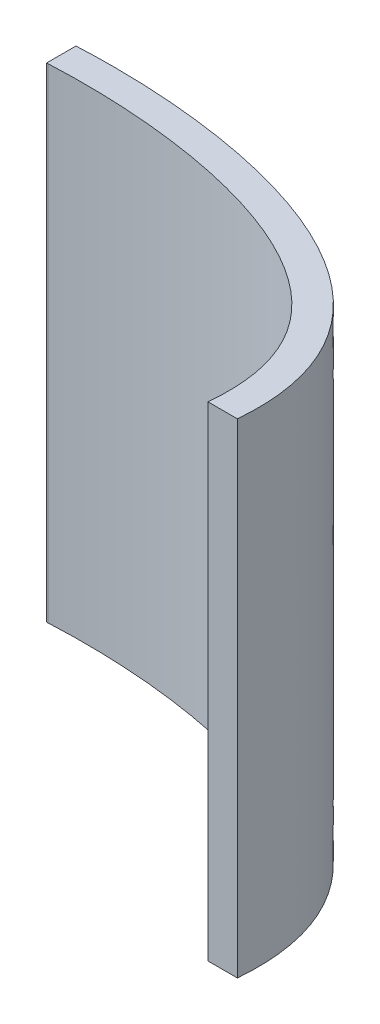
ISO-10303-21;
HEADER;
FILE_DESCRIPTION(('STEP AP214'),'2;1');
FILE_NAME('part.step','',(''),(''),'','','');
FILE_SCHEMA(('AUTOMOTIVE_DESIGN { 1 0 10303 214 1 1 1 1 }'));
ENDSEC;
DATA;
#1=APPLICATION_CONTEXT('core data for automotive mechanical design processes');
#2=APPLICATION_PROTOCOL_DEFINITION('international standard','automotive_design',2000,#1);
#3=PRODUCT_CONTEXT('',#1,'mechanical');
#4=PRODUCT('Part','Part','',(#3));
#5=PRODUCT_RELATED_PRODUCT_CATEGORY('part','',(#4));
#6=PRODUCT_DEFINITION_FORMATION('','',#4);
#7=PRODUCT_DEFINITION_CONTEXT('part definition',#1,'design');
#8=PRODUCT_DEFINITION('design','',#6,#7);
#9=PRODUCT_DEFINITION_SHAPE('','',#8);
#10=(LENGTH_UNIT() NAMED_UNIT(*) SI_UNIT(.MILLI.,.METRE.));
#11=(NAMED_UNIT(*) PLANE_ANGLE_UNIT() SI_UNIT($,.RADIAN.));
#12=(NAMED_UNIT(*) SI_UNIT($,.STERADIAN.) SOLID_ANGLE_UNIT());
#13=UNCERTAINTY_MEASURE_WITH_UNIT(LENGTH_MEASURE(1.E-05),#10,'distance_accuracy_value','');
#14=(GEOMETRIC_REPRESENTATION_CONTEXT(3) GLOBAL_UNCERTAINTY_ASSIGNED_CONTEXT((#13)) GLOBAL_UNIT_ASSIGNED_CONTEXT((#10,
#11,#12)) REPRESENTATION_CONTEXT('',''));
#15=CARTESIAN_POINT('',(0.,0.,0.));
#16=DIRECTION('',(0.,0.,1.));
#17=DIRECTION('',(1.,0.,0.));
#18=AXIS2_PLACEMENT_3D('',#15,#16,#17);
#19=CARTESIAN_POINT('',(183.579673977619,66.,-98.403989325521));
#20=CARTESIAN_POINT('',(186.002119086977,66.,-126.403762249864));
#21=CARTESIAN_POINT('',(150.81789137125,66.,-132.515318450877));
#22=CARTESIAN_POINT('',(128.579673977619,66.,-131.403989325521));
#23=B_SPLINE_CURVE_WITH_KNOTS('',3,(#19,#20,#21,#22),.UNSPECIFIED.,.F.,.F.,(4,4),(0.,1.),.UNSPECIFIED.);
#24=DIRECTION('',(0.,-1.,0.));
#25=VECTOR('',#24,1.);
#26=SURFACE_OF_LINEAR_EXTRUSION('',#23,#25);
#27=CARTESIAN_POINT('',(183.579673977619,0.,-98.403989325521));
#28=CARTESIAN_POINT('',(186.002119086977,0.,-126.403762249864));
#29=CARTESIAN_POINT('',(150.81789137125,0.,-132.515318450877));
#30=CARTESIAN_POINT('',(128.579673977619,0.,-131.403989325521));
#31=B_SPLINE_CURVE_WITH_KNOTS('',3,(#27,#28,#29,#30),.UNSPECIFIED.,.F.,.F.,(4,4),(0.,1.),.UNSPECIFIED.);
#32=CARTESIAN_POINT('',(183.579673977619,0.,-98.403989325521));
#33=VERTEX_POINT('',#32);
#34=CARTESIAN_POINT('',(128.579673977619,0.,-131.403989325521));
#35=VERTEX_POINT('',#34);
#36=EDGE_CURVE('E123',#33,#35,#31,.T.);
#37=ORIENTED_EDGE('',*,*,#36,.T.);
#38=DIRECTION('',(0.,-1.,0.));
#39=VECTOR('',#38,1.);
#40=CARTESIAN_POINT('',(128.579673977619,66.,-131.403989325521));
#41=LINE('',#40,#39);
#42=CARTESIAN_POINT('',(128.579673977619,66.,-131.403989325521));
#43=VERTEX_POINT('',#42);
#44=EDGE_CURVE('E11',#43,#35,#41,.T.);
#45=ORIENTED_EDGE('',*,*,#44,.F.);
#46=CARTESIAN_POINT('',(183.579673977619,66.,-98.403989325521));
#47=VERTEX_POINT('',#46);
#48=EDGE_CURVE('E143',#47,#43,#23,.T.);
#49=ORIENTED_EDGE('',*,*,#48,.F.);
#50=DIRECTION('',(0.,-1.,0.));
#51=VECTOR('',#50,1.);
#52=CARTESIAN_POINT('',(183.579673977619,66.,-98.403989325521));
#53=LINE('',#52,#51);
#54=EDGE_CURVE('E116',#47,#33,#53,.T.);
#55=ORIENTED_EDGE('',*,*,#54,.T.);
#56=EDGE_LOOP('',(#37,#45,#49,#55));
#57=FACE_BOUND('',#56,.T.);
#58=ADVANCED_FACE('F35',(#57),#26,.F.);
#59=CARTESIAN_POINT('',(128.579673977619,66.,-127.403989325521));
#60=DIRECTION('',(1.,0.,0.));
#61=DIRECTION('',(0.,0.,-1.));
#62=AXIS2_PLACEMENT_3D('',#59,#60,#61);
#63=PLANE('',#62);
#64=DIRECTION('',(0.,0.,1.));
#65=VECTOR('',#64,1.);
#66=CARTESIAN_POINT('',(128.579673977619,0.,-127.403989325521));
#67=LINE('',#66,#65);
#68=CARTESIAN_POINT('',(128.579673977619,0.,-127.403989325521));
#69=VERTEX_POINT('',#68);
#70=EDGE_CURVE('E128',#35,#69,#67,.T.);
#71=ORIENTED_EDGE('',*,*,#70,.T.);
#72=DIRECTION('',(0.,-1.,0.));
#73=VECTOR('',#72,1.);
#74=CARTESIAN_POINT('',(128.579673977619,66.,-127.403989325521));
#75=LINE('',#74,#73);
#76=CARTESIAN_POINT('',(128.579673977619,66.,-127.403989325521));
#77=VERTEX_POINT('',#76);
#78=EDGE_CURVE('E44',#77,#69,#75,.T.);
#79=ORIENTED_EDGE('',*,*,#78,.F.);
#80=DIRECTION('',(0.,0.,1.));
#81=VECTOR('',#80,1.);
#82=CARTESIAN_POINT('',(128.579673977619,66.,-127.403989325521));
#83=LINE('',#82,#81);
#84=EDGE_CURVE('E89',#43,#77,#83,.T.);
#85=ORIENTED_EDGE('',*,*,#84,.F.);
#86=ORIENTED_EDGE('',*,*,#44,.T.);
#87=EDGE_LOOP('',(#71,#79,#85,#86));
#88=FACE_BOUND('',#87,.T.);
#89=ADVANCED_FACE('F167',(#88),#63,.F.);
#90=CARTESIAN_POINT('',(128.779320197701,66.,-127.408974758989));
#91=DIRECTION('',(-0.02496355710716,0.,-0.99968836184911));
#92=DIRECTION('',(-0.99968836184911,0.,0.02496355710716));
#93=AXIS2_PLACEMENT_3D('',#90,#91,#92);
#94=PLANE('',#93);
#95=DIRECTION('',(0.99968836184911,0.,-0.02496355710716));
#96=VECTOR('',#95,1.);
#97=CARTESIAN_POINT('',(128.779320197701,0.,-127.408974758989));
#98=LINE('',#97,#96);
#99=CARTESIAN_POINT('',(128.779320197701,0.,-127.408974758989));
#100=VERTEX_POINT('',#99);
#101=EDGE_CURVE('E133',#69,#100,#98,.T.);
#102=ORIENTED_EDGE('',*,*,#101,.T.);
#103=DIRECTION('',(0.,-1.,0.));
#104=VECTOR('',#103,1.);
#105=CARTESIAN_POINT('',(128.779320197701,66.,-127.408974758989));
#106=LINE('',#105,#104);
#107=CARTESIAN_POINT('',(128.779320197701,66.,-127.408974758989));
#108=VERTEX_POINT('',#107);
#109=EDGE_CURVE('E111',#108,#100,#106,.T.);
#110=ORIENTED_EDGE('',*,*,#109,.F.);
#111=DIRECTION('',(0.99968836184911,0.,-0.02496355710716));
#112=VECTOR('',#111,1.);
#113=CARTESIAN_POINT('',(128.779320197701,66.,-127.408974758989));
#114=LINE('',#113,#112);
#115=EDGE_CURVE('E102',#77,#108,#114,.T.);
#116=ORIENTED_EDGE('',*,*,#115,.F.);
#117=ORIENTED_EDGE('',*,*,#78,.T.);
#118=EDGE_LOOP('',(#102,#110,#116,#117));
#119=FACE_BOUND('',#118,.T.);
#120=ADVANCED_FACE('F149',(#119),#94,.F.);
#121=CARTESIAN_POINT('',(128.779320197701,66.,-127.408974758989));
#122=CARTESIAN_POINT('',(129.456925244593,66.,-127.442837285412));
#123=CARTESIAN_POINT('',(130.796469521896,66.,-127.495054960408));
#124=CARTESIAN_POINT('',(133.608856634455,66.,-127.544195587618));
#125=CARTESIAN_POINT('',(137.25196993619,66.,-127.490289040362));
#126=CARTESIAN_POINT('',(141.777282013881,66.,-127.221776910639));
#127=CARTESIAN_POINT('',(147.898035457045,66.,-126.565632751634));
#128=CARTESIAN_POINT('',(155.516447722676,66.,-125.140481347101));
#129=CARTESIAN_POINT('',(163.959933838613,66.,-122.341583271431));
#130=CARTESIAN_POINT('',(169.876032605257,66.,-119.055757917601));
#131=CARTESIAN_POINT('',(173.667431344113,66.,-115.871614333157));
#132=CARTESIAN_POINT('',(176.001562959465,66.,-113.207973183674));
#133=CARTESIAN_POINT('',(177.804863705281,66.,-110.248156926474));
#134=CARTESIAN_POINT('',(178.852838991469,66.,-107.484701631807));
#135=CARTESIAN_POINT('',(179.396589335684,66.,-105.048198520399));
#136=CARTESIAN_POINT('',(179.647182856934,66.,-103.096696056337));
#137=CARTESIAN_POINT('',(179.714900134768,66.,-101.353981418927));
#138=CARTESIAN_POINT('',(179.678303177813,66.,-99.8940338893161));
#139=CARTESIAN_POINT('',(179.6272707756,66.,-99.1268463675959));
#140=CARTESIAN_POINT('',(179.594560701445,66.,-98.7487677704102));
#141=B_SPLINE_CURVE_WITH_KNOTS('',3,(#121,#122,#123,#124,#125,#126,#127,#128,#129,#130,#131,
#132,#133,#134,#135,#136,#137,#138,#139,#140),.UNSPECIFIED.,.F.,.F.,(4,1,1,1,1,1,1,1,1,1,1,1,1,
1,1,1,1,4),(0.,0.03125,0.0625,0.125,0.1875,0.25,0.375,0.5,0.625,0.6875,0.75,0.8125,0.875,
0.90625,0.9375,0.96875,0.984375,1.),.UNSPECIFIED.);
#142=DIRECTION('',(0.,-1.,0.));
#143=VECTOR('',#142,1.);
#144=SURFACE_OF_LINEAR_EXTRUSION('',#141,#143);
#145=CARTESIAN_POINT('',(128.779320197701,0.,-127.408974758989));
#146=CARTESIAN_POINT('',(129.456925244593,0.,-127.442837285412));
#147=CARTESIAN_POINT('',(130.796469521896,0.,-127.495054960408));
#148=CARTESIAN_POINT('',(133.608856634455,0.,-127.544195587618));
#149=CARTESIAN_POINT('',(137.25196993619,0.,-127.490289040362));
#150=CARTESIAN_POINT('',(141.777282013881,0.,-127.221776910639));
#151=CARTESIAN_POINT('',(147.898035457045,0.,-126.565632751634));
#152=CARTESIAN_POINT('',(155.516447722676,0.,-125.140481347101));
#153=CARTESIAN_POINT('',(163.959933838613,0.,-122.341583271431));
#154=CARTESIAN_POINT('',(169.876032605257,0.,-119.055757917601));
#155=CARTESIAN_POINT('',(173.667431344113,0.,-115.871614333157));
#156=CARTESIAN_POINT('',(176.001562959465,0.,-113.207973183674));
#157=CARTESIAN_POINT('',(177.804863705281,0.,-110.248156926474));
#158=CARTESIAN_POINT('',(178.852838991469,0.,-107.484701631807));
#159=CARTESIAN_POINT('',(179.396589335684,0.,-105.048198520399));
#160=CARTESIAN_POINT('',(179.647182856934,0.,-103.096696056337));
#161=CARTESIAN_POINT('',(179.714900134768,0.,-101.353981418927));
#162=CARTESIAN_POINT('',(179.678303177813,0.,-99.8940338893161));
#163=CARTESIAN_POINT('',(179.6272707756,0.,-99.1268463675959));
#164=CARTESIAN_POINT('',(179.594560701445,0.,-98.7487677704102));
#165=B_SPLINE_CURVE_WITH_KNOTS('',3,(#145,#146,#147,#148,#149,#150,#151,#152,#153,#154,#155,
#156,#157,#158,#159,#160,#161,#162,#163,#164),.UNSPECIFIED.,.F.,.F.,(4,1,1,1,1,1,1,1,1,1,1,1,1,
1,1,1,1,4),(0.,0.03125,0.0625,0.125,0.1875,0.25,0.375,0.5,0.625,0.6875,0.75,0.8125,0.875,
0.90625,0.9375,0.96875,0.984375,1.),.UNSPECIFIED.);
#166=CARTESIAN_POINT('',(179.594560701445,0.,-98.7487677704102));
#167=VERTEX_POINT('',#166);
#168=EDGE_CURVE('E110',#100,#167,#165,.T.);
#169=ORIENTED_EDGE('',*,*,#168,.T.);
#170=DIRECTION('',(0.,-1.,0.));
#171=VECTOR('',#170,1.);
#172=CARTESIAN_POINT('',(179.594560701445,66.,-98.7487677704102));
#173=LINE('',#172,#171);
#174=CARTESIAN_POINT('',(179.594560701445,66.,-98.7487677704102));
#175=VERTEX_POINT('',#174);
#176=EDGE_CURVE('E107',#175,#167,#173,.T.);
#177=ORIENTED_EDGE('',*,*,#176,.F.);
#178=EDGE_CURVE('E96',#108,#175,#141,.T.);
#179=ORIENTED_EDGE('',*,*,#178,.F.);
#180=ORIENTED_EDGE('',*,*,#109,.T.);
#181=EDGE_LOOP('',(#169,#177,#179,#180));
#182=FACE_BOUND('',#181,.T.);
#183=ADVANCED_FACE('F108',(#182),#144,.F.);
#184=CARTESIAN_POINT('',(179.594560701445,66.,-98.7487677704102));
#185=DIRECTION('',(0.999069146516781,0.,0.043137460266332));
#186=DIRECTION('',(0.0431374602663321,0.,-0.999069146516782));
#187=AXIS2_PLACEMENT_3D('',#184,#185,#186);
#188=PLANE('',#187);
#189=DIRECTION('',(-0.0431374602663321,0.,0.999069146516782));
#190=VECTOR('',#189,1.);
#191=CARTESIAN_POINT('',(179.594560701445,0.,-98.7487677704102));
#192=LINE('',#191,#190);
#193=CARTESIAN_POINT('',(179.579673977619,0.,-98.403989325521));
#194=VERTEX_POINT('',#193);
#195=EDGE_CURVE('E75',#167,#194,#192,.T.);
#196=ORIENTED_EDGE('',*,*,#195,.T.);
#197=DIRECTION('',(0.,-1.,0.));
#198=VECTOR('',#197,1.);
#199=CARTESIAN_POINT('',(179.579673977619,66.,-98.403989325521));
#200=LINE('',#199,#198);
#201=CARTESIAN_POINT('',(179.579673977619,66.,-98.403989325521));
#202=VERTEX_POINT('',#201);
#203=EDGE_CURVE('E112',#202,#194,#200,.T.);
#204=ORIENTED_EDGE('',*,*,#203,.F.);
#205=DIRECTION('',(-0.0431374602663321,0.,0.999069146516782));
#206=VECTOR('',#205,1.);
#207=CARTESIAN_POINT('',(179.594560701445,66.,-98.7487677704102));
#208=LINE('',#207,#206);
#209=EDGE_CURVE('E100',#175,#202,#208,.T.);
#210=ORIENTED_EDGE('',*,*,#209,.F.);
#211=ORIENTED_EDGE('',*,*,#176,.T.);
#212=EDGE_LOOP('',(#196,#204,#210,#211));
#213=FACE_BOUND('',#212,.T.);
#214=ADVANCED_FACE('F114',(#213),#188,.F.);
#215=CARTESIAN_POINT('',(179.579673977619,66.,-98.403989325521));
#216=DIRECTION('',(0.,0.,-1.));
#217=DIRECTION('',(-1.,0.,0.));
#218=AXIS2_PLACEMENT_3D('',#215,#216,#217);
#219=PLANE('',#218);
#220=DIRECTION('',(1.,0.,0.));
#221=VECTOR('',#220,1.);
#222=CARTESIAN_POINT('',(179.579673977619,0.,-98.403989325521));
#223=LINE('',#222,#221);
#224=EDGE_CURVE('E81',#194,#33,#223,.T.);
#225=ORIENTED_EDGE('',*,*,#224,.T.);
#226=ORIENTED_EDGE('',*,*,#54,.F.);
#227=DIRECTION('',(1.,0.,0.));
#228=VECTOR('',#227,1.);
#229=CARTESIAN_POINT('',(179.579673977619,66.,-98.403989325521));
#230=LINE('',#229,#228);
#231=EDGE_CURVE('E52',#202,#47,#230,.T.);
#232=ORIENTED_EDGE('',*,*,#231,.F.);
#233=ORIENTED_EDGE('',*,*,#203,.T.);
#234=EDGE_LOOP('',(#225,#226,#232,#233));
#235=FACE_BOUND('',#234,.T.);
#236=ADVANCED_FACE('F156',(#235),#219,.F.);
#237=CARTESIAN_POINT('',(165.32742241624,66.,-125.820652594158));
#238=DIRECTION('',(0.,1.,0.));
#239=DIRECTION('',(0.,0.,1.));
#240=AXIS2_PLACEMENT_3D('',#237,#238,#239);
#241=PLANE('',#240);
#242=ORIENTED_EDGE('',*,*,#48,.T.);
#243=ORIENTED_EDGE('',*,*,#84,.T.);
#244=ORIENTED_EDGE('',*,*,#115,.T.);
#245=ORIENTED_EDGE('',*,*,#178,.T.);
#246=ORIENTED_EDGE('',*,*,#209,.T.);
#247=ORIENTED_EDGE('',*,*,#231,.T.);
#248=EDGE_LOOP('',(#242,#243,#244,#245,#246,#247));
#249=FACE_BOUND('',#248,.T.);
#250=ADVANCED_FACE('F98',(#249),#241,.T.);
#251=CARTESIAN_POINT('',(165.32742241624,0.,-125.820652594158));
#252=DIRECTION('',(0.,1.,0.));
#253=DIRECTION('',(0.,0.,1.));
#254=AXIS2_PLACEMENT_3D('',#251,#252,#253);
#255=PLANE('',#254);
#256=ORIENTED_EDGE('',*,*,#36,.F.);
#257=ORIENTED_EDGE('',*,*,#224,.F.);
#258=ORIENTED_EDGE('',*,*,#195,.F.);
#259=ORIENTED_EDGE('',*,*,#168,.F.);
#260=ORIENTED_EDGE('',*,*,#101,.F.);
#261=ORIENTED_EDGE('',*,*,#70,.F.);
#262=EDGE_LOOP('',(#256,#257,#258,#259,#260,#261));
#263=FACE_BOUND('',#262,.T.);
#264=ADVANCED_FACE('F152',(#263),#255,.F.);
#265=CLOSED_SHELL('',(#58,#89,#120,#183,#214,#236,#250,#264));
#266=MANIFOLD_SOLID_BREP('B2',#265);
#267=ADVANCED_BREP_SHAPE_REPRESENTATION('',(#18,#266),#14);
#268=SHAPE_DEFINITION_REPRESENTATION(#9,#267);
ENDSEC;
END-ISO-10303-21;
